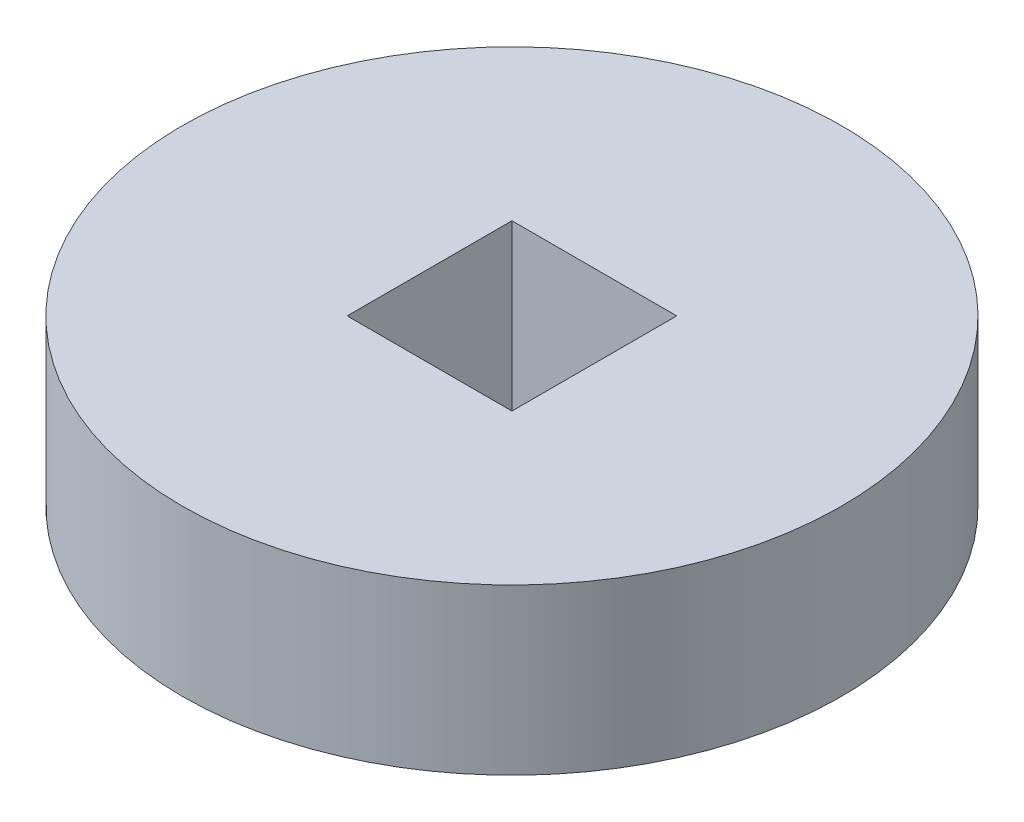
ISO-10303-21;
HEADER;
FILE_DESCRIPTION(('STEP AP214'),'2;1');
FILE_NAME('part.step','',(''),(''),'','','');
FILE_SCHEMA(('AUTOMOTIVE_DESIGN { 1 0 10303 214 1 1 1 1 }'));
ENDSEC;
DATA;
#1=APPLICATION_CONTEXT('core data for automotive mechanical design processes');
#2=APPLICATION_PROTOCOL_DEFINITION('international standard','automotive_design',2000,#1);
#3=PRODUCT_CONTEXT('',#1,'mechanical');
#4=PRODUCT('Part','Part','',(#3));
#5=PRODUCT_RELATED_PRODUCT_CATEGORY('part','',(#4));
#6=PRODUCT_DEFINITION_FORMATION('','',#4);
#7=PRODUCT_DEFINITION_CONTEXT('part definition',#1,'design');
#8=PRODUCT_DEFINITION('design','',#6,#7);
#9=PRODUCT_DEFINITION_SHAPE('','',#8);
#10=(LENGTH_UNIT() NAMED_UNIT(*) SI_UNIT(.MILLI.,.METRE.));
#11=(NAMED_UNIT(*) PLANE_ANGLE_UNIT() SI_UNIT($,.RADIAN.));
#12=(NAMED_UNIT(*) SI_UNIT($,.STERADIAN.) SOLID_ANGLE_UNIT());
#13=UNCERTAINTY_MEASURE_WITH_UNIT(LENGTH_MEASURE(1.E-05),#10,'distance_accuracy_value','');
#14=(GEOMETRIC_REPRESENTATION_CONTEXT(3) GLOBAL_UNCERTAINTY_ASSIGNED_CONTEXT((#13)) GLOBAL_UNIT_ASSIGNED_CONTEXT((#10,
#11,#12)) REPRESENTATION_CONTEXT('',''));
#15=CARTESIAN_POINT('',(0.,0.,0.));
#16=DIRECTION('',(0.,0.,1.));
#17=DIRECTION('',(1.,0.,0.));
#18=AXIS2_PLACEMENT_3D('',#15,#16,#17);
#19=CARTESIAN_POINT('',(3.175,6.35,0.));
#20=DIRECTION('',(-1.,0.,0.));
#21=DIRECTION('',(0.,0.,1.));
#22=AXIS2_PLACEMENT_3D('',#19,#20,#21);
#23=PLANE('',#22);
#24=DIRECTION('',(0.,0.,-1.));
#25=VECTOR('',#24,1.);
#26=CARTESIAN_POINT('',(3.175,0.,0.));
#27=LINE('',#26,#25);
#28=CARTESIAN_POINT('',(3.175,0.,3.175));
#29=VERTEX_POINT('',#28);
#30=CARTESIAN_POINT('',(3.175,0.,-3.175));
#31=VERTEX_POINT('',#30);
#32=EDGE_CURVE('E102',#29,#31,#27,.T.);
#33=ORIENTED_EDGE('',*,*,#32,.F.);
#34=DIRECTION('',(0.,-1.,0.));
#35=VECTOR('',#34,1.);
#36=CARTESIAN_POINT('',(3.175,6.35,3.175));
#37=LINE('',#36,#35);
#38=CARTESIAN_POINT('',(3.175,6.35,3.175));
#39=VERTEX_POINT('',#38);
#40=EDGE_CURVE('E11',#39,#29,#37,.T.);
#41=ORIENTED_EDGE('',*,*,#40,.F.);
#42=DIRECTION('',(0.,0.,-1.));
#43=VECTOR('',#42,1.);
#44=CARTESIAN_POINT('',(3.175,6.35,0.));
#45=LINE('',#44,#43);
#46=CARTESIAN_POINT('',(3.175,6.35,-3.175));
#47=VERTEX_POINT('',#46);
#48=EDGE_CURVE('E93',#39,#47,#45,.T.);
#49=ORIENTED_EDGE('',*,*,#48,.T.);
#50=DIRECTION('',(0.,-1.,0.));
#51=VECTOR('',#50,1.);
#52=CARTESIAN_POINT('',(3.175,6.35,-3.175));
#53=LINE('',#52,#51);
#54=EDGE_CURVE('E73',#47,#31,#53,.T.);
#55=ORIENTED_EDGE('',*,*,#54,.T.);
#56=EDGE_LOOP('',(#33,#41,#49,#55));
#57=FACE_BOUND('',#56,.T.);
#58=ADVANCED_FACE('F35',(#57),#23,.T.);
#59=CARTESIAN_POINT('',(0.,6.35,3.175));
#60=DIRECTION('',(0.,0.,-1.));
#61=DIRECTION('',(-1.,0.,0.));
#62=AXIS2_PLACEMENT_3D('',#59,#60,#61);
#63=PLANE('',#62);
#64=DIRECTION('',(1.,0.,0.));
#65=VECTOR('',#64,1.);
#66=CARTESIAN_POINT('',(0.,0.,3.175));
#67=LINE('',#66,#65);
#68=CARTESIAN_POINT('',(-3.175,0.,3.175));
#69=VERTEX_POINT('',#68);
#70=EDGE_CURVE('E86',#69,#29,#67,.T.);
#71=ORIENTED_EDGE('',*,*,#70,.F.);
#72=DIRECTION('',(0.,-1.,0.));
#73=VECTOR('',#72,1.);
#74=CARTESIAN_POINT('',(-3.175,6.35,3.175));
#75=LINE('',#74,#73);
#76=CARTESIAN_POINT('',(-3.175,6.35,3.175));
#77=VERTEX_POINT('',#76);
#78=EDGE_CURVE('E43',#77,#69,#75,.T.);
#79=ORIENTED_EDGE('',*,*,#78,.F.);
#80=DIRECTION('',(1.,0.,0.));
#81=VECTOR('',#80,1.);
#82=CARTESIAN_POINT('',(0.,6.35,3.175));
#83=LINE('',#82,#81);
#84=EDGE_CURVE('E84',#77,#39,#83,.T.);
#85=ORIENTED_EDGE('',*,*,#84,.T.);
#86=ORIENTED_EDGE('',*,*,#40,.T.);
#87=EDGE_LOOP('',(#71,#79,#85,#86));
#88=FACE_BOUND('',#87,.T.);
#89=ADVANCED_FACE('F82',(#88),#63,.T.);
#90=CARTESIAN_POINT('',(-3.175,6.35,0.));
#91=DIRECTION('',(-1.,0.,0.));
#92=DIRECTION('',(0.,0.,1.));
#93=AXIS2_PLACEMENT_3D('',#90,#91,#92);
#94=PLANE('',#93);
#95=DIRECTION('',(0.,0.,-1.));
#96=VECTOR('',#95,1.);
#97=CARTESIAN_POINT('',(-3.175,0.,0.));
#98=LINE('',#97,#96);
#99=CARTESIAN_POINT('',(-3.175,0.,-3.175));
#100=VERTEX_POINT('',#99);
#101=EDGE_CURVE('E66',#69,#100,#98,.T.);
#102=ORIENTED_EDGE('',*,*,#101,.T.);
#103=DIRECTION('',(0.,-1.,0.));
#104=VECTOR('',#103,1.);
#105=CARTESIAN_POINT('',(-3.175,6.35,-3.175));
#106=LINE('',#105,#104);
#107=CARTESIAN_POINT('',(-3.175,6.35,-3.175));
#108=VERTEX_POINT('',#107);
#109=EDGE_CURVE('E87',#108,#100,#106,.T.);
#110=ORIENTED_EDGE('',*,*,#109,.F.);
#111=DIRECTION('',(0.,0.,-1.));
#112=VECTOR('',#111,1.);
#113=CARTESIAN_POINT('',(-3.175,6.35,0.));
#114=LINE('',#113,#112);
#115=EDGE_CURVE('E88',#77,#108,#114,.T.);
#116=ORIENTED_EDGE('',*,*,#115,.F.);
#117=ORIENTED_EDGE('',*,*,#78,.T.);
#118=EDGE_LOOP('',(#102,#110,#116,#117));
#119=FACE_BOUND('',#118,.T.);
#120=ADVANCED_FACE('F89',(#119),#94,.F.);
#121=CARTESIAN_POINT('',(0.,6.35,-3.175));
#122=DIRECTION('',(0.,0.,-1.));
#123=DIRECTION('',(-1.,0.,0.));
#124=AXIS2_PLACEMENT_3D('',#121,#122,#123);
#125=PLANE('',#124);
#126=DIRECTION('',(1.,0.,0.));
#127=VECTOR('',#126,1.);
#128=CARTESIAN_POINT('',(0.,0.,-3.175));
#129=LINE('',#128,#127);
#130=EDGE_CURVE('E107',#100,#31,#129,.T.);
#131=ORIENTED_EDGE('',*,*,#130,.T.);
#132=ORIENTED_EDGE('',*,*,#54,.F.);
#133=DIRECTION('',(1.,0.,0.));
#134=VECTOR('',#133,1.);
#135=CARTESIAN_POINT('',(0.,6.35,-3.175));
#136=LINE('',#135,#134);
#137=EDGE_CURVE('E51',#108,#47,#136,.T.);
#138=ORIENTED_EDGE('',*,*,#137,.F.);
#139=ORIENTED_EDGE('',*,*,#109,.T.);
#140=EDGE_LOOP('',(#131,#132,#138,#139));
#141=FACE_BOUND('',#140,.T.);
#142=ADVANCED_FACE('F114',(#141),#125,.F.);
#143=CARTESIAN_POINT('',(0.,6.35,0.));
#144=DIRECTION('',(0.,-1.,0.));
#145=DIRECTION('',(0.,0.,-1.));
#146=AXIS2_PLACEMENT_3D('',#143,#144,#145);
#147=CYLINDRICAL_SURFACE('',#146,12.7);
#148=CARTESIAN_POINT('',(0.,6.35,0.));
#149=DIRECTION('',(0.,1.,0.));
#150=DIRECTION('',(0.,0.,1.));
#151=AXIS2_PLACEMENT_3D('',#148,#149,#150);
#152=CIRCLE('',#151,12.7);
#153=CARTESIAN_POINT('',(0.,6.35,12.7));
#154=VERTEX_POINT('',#153);
#155=EDGE_CURVE('E99',#154,#154,#152,.T.);
#156=ORIENTED_EDGE('',*,*,#155,.F.);
#157=EDGE_LOOP('',(#156));
#158=FACE_BOUND('',#157,.T.);
#159=CARTESIAN_POINT('',(0.,0.,0.));
#160=DIRECTION('',(0.,1.,0.));
#161=DIRECTION('',(0.,0.,1.));
#162=AXIS2_PLACEMENT_3D('',#159,#160,#161);
#163=CIRCLE('',#162,12.7);
#164=CARTESIAN_POINT('',(0.,0.,12.7));
#165=VERTEX_POINT('',#164);
#166=EDGE_CURVE('E95',#165,#165,#163,.T.);
#167=ORIENTED_EDGE('',*,*,#166,.T.);
#168=EDGE_LOOP('',(#167));
#169=FACE_BOUND('',#168,.T.);
#170=ADVANCED_FACE('F129',(#158,#169),#147,.T.);
#171=CARTESIAN_POINT('',(0.,6.35,0.));
#172=DIRECTION('',(0.,1.,0.));
#173=DIRECTION('',(0.,0.,1.));
#174=AXIS2_PLACEMENT_3D('',#171,#172,#173);
#175=PLANE('',#174);
#176=ORIENTED_EDGE('',*,*,#48,.F.);
#177=ORIENTED_EDGE('',*,*,#84,.F.);
#178=ORIENTED_EDGE('',*,*,#115,.T.);
#179=ORIENTED_EDGE('',*,*,#137,.T.);
#180=EDGE_LOOP('',(#176,#177,#178,#179));
#181=FACE_BOUND('',#180,.T.);
#182=ORIENTED_EDGE('',*,*,#155,.T.);
#183=EDGE_LOOP('',(#182));
#184=FACE_BOUND('',#183,.T.);
#185=ADVANCED_FACE('F91',(#181,#184),#175,.T.);
#186=CARTESIAN_POINT('',(0.,0.,0.));
#187=DIRECTION('',(0.,1.,0.));
#188=DIRECTION('',(0.,0.,1.));
#189=AXIS2_PLACEMENT_3D('',#186,#187,#188);
#190=PLANE('',#189);
#191=ORIENTED_EDGE('',*,*,#32,.T.);
#192=ORIENTED_EDGE('',*,*,#130,.F.);
#193=ORIENTED_EDGE('',*,*,#101,.F.);
#194=ORIENTED_EDGE('',*,*,#70,.T.);
#195=EDGE_LOOP('',(#191,#192,#193,#194));
#196=FACE_BOUND('',#195,.T.);
#197=ORIENTED_EDGE('',*,*,#166,.F.);
#198=EDGE_LOOP('',(#197));
#199=FACE_BOUND('',#198,.T.);
#200=ADVANCED_FACE('F116',(#196,#199),#190,.F.);
#201=CLOSED_SHELL('',(#58,#89,#120,#142,#170,#185,#200));
#202=MANIFOLD_SOLID_BREP('B2',#201);
#203=ADVANCED_BREP_SHAPE_REPRESENTATION('',(#18,#202),#14);
#204=SHAPE_DEFINITION_REPRESENTATION(#9,#203);
ENDSEC;
END-ISO-10303-21;
